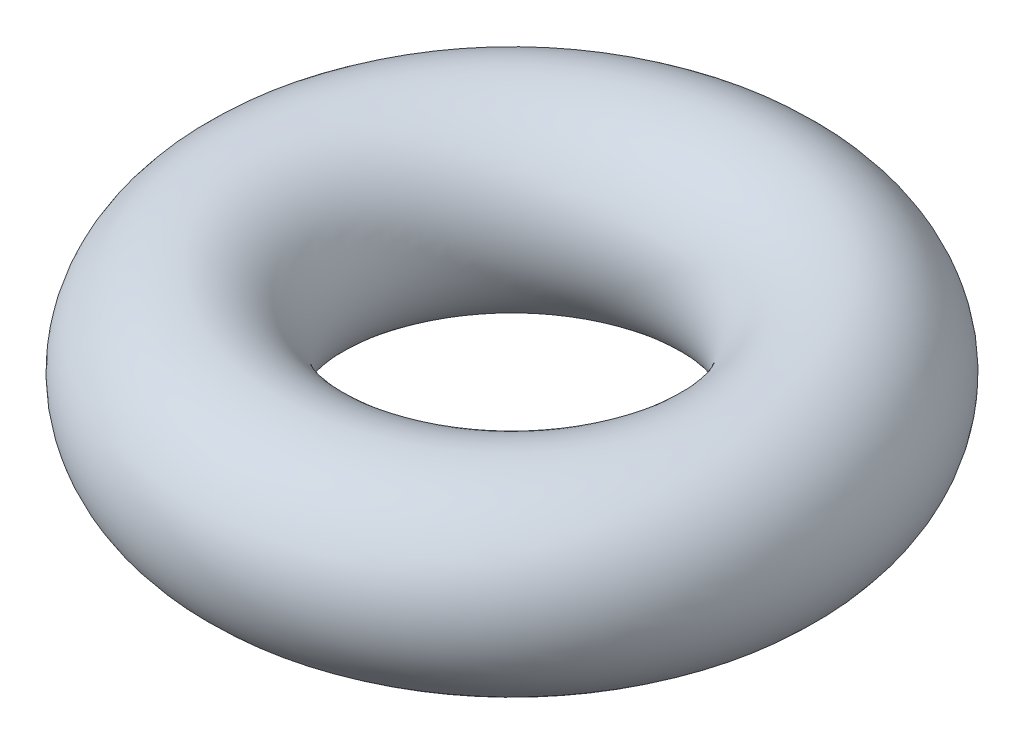
ISO-10303-21;
HEADER;
FILE_DESCRIPTION(('STEP AP214'),'2;1');
FILE_NAME('part.step','',(''),(''),'','','');
FILE_SCHEMA(('AUTOMOTIVE_DESIGN { 1 0 10303 214 1 1 1 1 }'));
ENDSEC;
DATA;
#1=APPLICATION_CONTEXT('core data for automotive mechanical design processes');
#2=APPLICATION_PROTOCOL_DEFINITION('international standard','automotive_design',2000,#1);
#3=PRODUCT_CONTEXT('',#1,'mechanical');
#4=PRODUCT('Part','Part','',(#3));
#5=PRODUCT_RELATED_PRODUCT_CATEGORY('part','',(#4));
#6=PRODUCT_DEFINITION_FORMATION('','',#4);
#7=PRODUCT_DEFINITION_CONTEXT('part definition',#1,'design');
#8=PRODUCT_DEFINITION('design','',#6,#7);
#9=PRODUCT_DEFINITION_SHAPE('','',#8);
#10=(LENGTH_UNIT() NAMED_UNIT(*) SI_UNIT(.MILLI.,.METRE.));
#11=(NAMED_UNIT(*) PLANE_ANGLE_UNIT() SI_UNIT($,.RADIAN.));
#12=(NAMED_UNIT(*) SI_UNIT($,.STERADIAN.) SOLID_ANGLE_UNIT());
#13=UNCERTAINTY_MEASURE_WITH_UNIT(LENGTH_MEASURE(1.E-05),#10,'distance_accuracy_value','');
#14=(GEOMETRIC_REPRESENTATION_CONTEXT(3) GLOBAL_UNCERTAINTY_ASSIGNED_CONTEXT((#13)) GLOBAL_UNIT_ASSIGNED_CONTEXT((#10,
#11,#12)) REPRESENTATION_CONTEXT('',''));
#15=CARTESIAN_POINT('',(0.,0.,0.));
#16=DIRECTION('',(0.,0.,1.));
#17=DIRECTION('',(1.,0.,0.));
#18=AXIS2_PLACEMENT_3D('',#15,#16,#17);
#19=CARTESIAN_POINT('',(0.,0.,0.));
#20=DIRECTION('',(0.,-1.,0.));
#21=DIRECTION('',(0.,0.,-1.));
#22=AXIS2_PLACEMENT_3D('',#19,#20,#21);
#23=TOROIDAL_SURFACE('',#22,5.,2.);
#24=CARTESIAN_POINT('',(0.,0.,-7.));
#25=VERTEX_POINT('',#24);
#26=VERTEX_LOOP('',#25);
#27=FACE_BOUND('',#26,.T.);
#28=ADVANCED_FACE('F31',(#27),#23,.T.);
#29=CLOSED_SHELL('',(#28));
#30=MANIFOLD_SOLID_BREP('B2',#29);
#31=ADVANCED_BREP_SHAPE_REPRESENTATION('',(#18,#30),#14);
#32=SHAPE_DEFINITION_REPRESENTATION(#9,#31);
ENDSEC;
END-ISO-10303-21;
